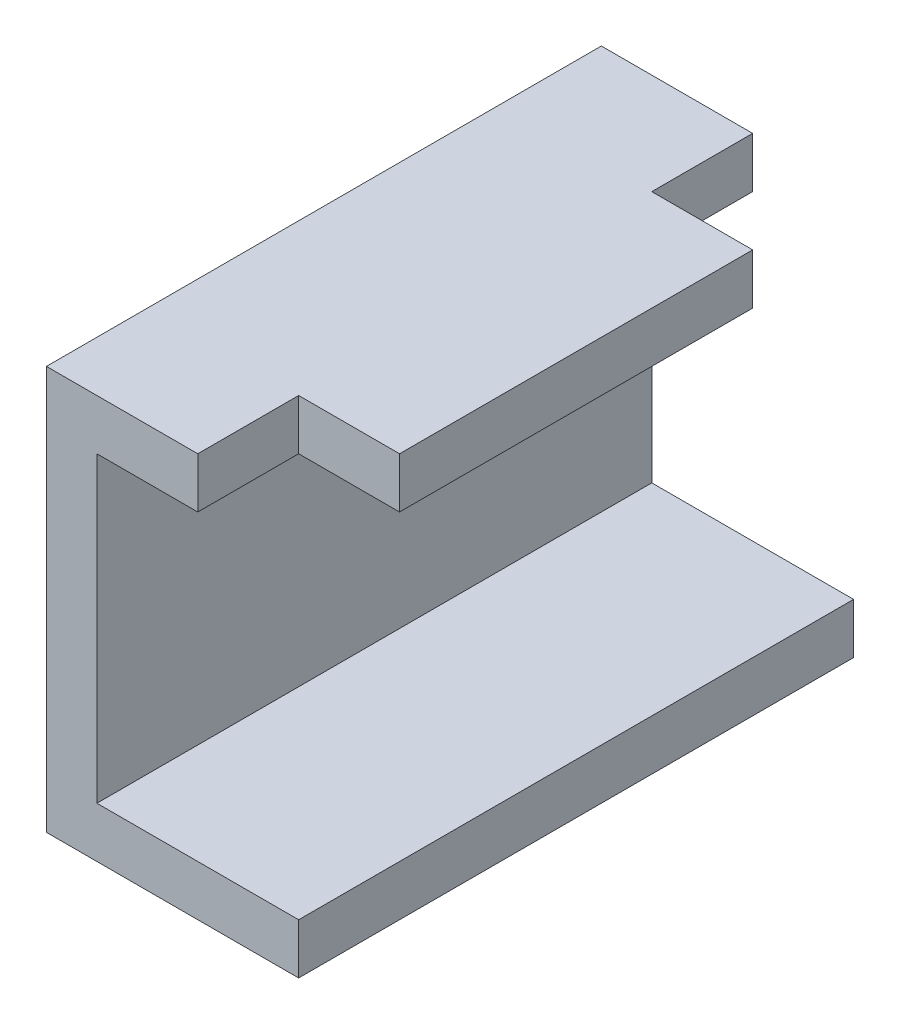
ISO-10303-21;
HEADER;
FILE_DESCRIPTION(('STEP AP214'),'2;1');
FILE_NAME('part.step','',(''),(''),'','','');
FILE_SCHEMA(('AUTOMOTIVE_DESIGN { 1 0 10303 214 1 1 1 1 }'));
ENDSEC;
DATA;
#1=APPLICATION_CONTEXT('core data for automotive mechanical design processes');
#2=APPLICATION_PROTOCOL_DEFINITION('international standard','automotive_design',2000,#1);
#3=PRODUCT_CONTEXT('',#1,'mechanical');
#4=PRODUCT('Part','Part','',(#3));
#5=PRODUCT_RELATED_PRODUCT_CATEGORY('part','',(#4));
#6=PRODUCT_DEFINITION_FORMATION('','',#4);
#7=PRODUCT_DEFINITION_CONTEXT('part definition',#1,'design');
#8=PRODUCT_DEFINITION('design','',#6,#7);
#9=PRODUCT_DEFINITION_SHAPE('','',#8);
#10=(LENGTH_UNIT() NAMED_UNIT(*) SI_UNIT(.MILLI.,.METRE.));
#11=(NAMED_UNIT(*) PLANE_ANGLE_UNIT() SI_UNIT($,.RADIAN.));
#12=(NAMED_UNIT(*) SI_UNIT($,.STERADIAN.) SOLID_ANGLE_UNIT());
#13=UNCERTAINTY_MEASURE_WITH_UNIT(LENGTH_MEASURE(1.E-05),#10,'distance_accuracy_value','');
#14=(GEOMETRIC_REPRESENTATION_CONTEXT(3) GLOBAL_UNCERTAINTY_ASSIGNED_CONTEXT((#13)) GLOBAL_UNIT_ASSIGNED_CONTEXT((#10,
#11,#12)) REPRESENTATION_CONTEXT('',''));
#15=CARTESIAN_POINT('',(0.,0.,0.));
#16=DIRECTION('',(0.,0.,1.));
#17=DIRECTION('',(1.,0.,0.));
#18=AXIS2_PLACEMENT_3D('',#15,#16,#17);
#19=CARTESIAN_POINT('',(4.428,3.0256,3.662));
#20=DIRECTION('',(0.,-1.,0.));
#21=DIRECTION('',(0.,0.,-1.));
#22=AXIS2_PLACEMENT_3D('',#19,#20,#21);
#23=PLANE('',#22);
#24=DIRECTION('',(0.,0.,1.));
#25=VECTOR('',#24,1.);
#26=CARTESIAN_POINT('',(4.628,3.0256,3.662));
#27=LINE('',#26,#25);
#28=CARTESIAN_POINT('',(4.628,3.0256,3.662));
#29=VERTEX_POINT('',#28);
#30=CARTESIAN_POINT('',(4.628,3.0256,4.212));
#31=VERTEX_POINT('',#30);
#32=EDGE_CURVE('E11',#29,#31,#27,.T.);
#33=ORIENTED_EDGE('',*,*,#32,.F.);
#34=DIRECTION('',(1.,0.,0.));
#35=VECTOR('',#34,1.);
#36=CARTESIAN_POINT('',(4.428,3.0256,3.662));
#37=LINE('',#36,#35);
#38=CARTESIAN_POINT('',(4.428,3.0256,3.662));
#39=VERTEX_POINT('',#38);
#40=EDGE_CURVE('E24',#39,#29,#37,.T.);
#41=ORIENTED_EDGE('',*,*,#40,.F.);
#42=DIRECTION('',(0.,0.,-1.));
#43=VECTOR('',#42,1.);
#44=CARTESIAN_POINT('',(4.428,3.0256,3.662));
#45=LINE('',#44,#43);
#46=CARTESIAN_POINT('',(4.428,3.0256,4.212));
#47=VERTEX_POINT('',#46);
#48=EDGE_CURVE('E203',#47,#39,#45,.T.);
#49=ORIENTED_EDGE('',*,*,#48,.F.);
#50=DIRECTION('',(1.,0.,0.));
#51=VECTOR('',#50,1.);
#52=CARTESIAN_POINT('',(4.428,3.0256,4.212));
#53=LINE('',#52,#51);
#54=EDGE_CURVE('E201',#47,#31,#53,.T.);
#55=ORIENTED_EDGE('',*,*,#54,.T.);
#56=EDGE_LOOP('',(#33,#41,#49,#55));
#57=FACE_BOUND('',#56,.T.);
#58=ADVANCED_FACE('F17',(#57),#23,.F.);
#59=CARTESIAN_POINT('',(4.378,2.9756,4.212));
#60=DIRECTION('',(0.,1.,0.));
#61=DIRECTION('',(0.,0.,1.));
#62=AXIS2_PLACEMENT_3D('',#59,#60,#61);
#63=PLANE('',#62);
#64=DIRECTION('',(0.,0.,-1.));
#65=VECTOR('',#64,1.);
#66=CARTESIAN_POINT('',(4.628,2.9756,4.212));
#67=LINE('',#66,#65);
#68=CARTESIAN_POINT('',(4.628,2.9756,4.212));
#69=VERTEX_POINT('',#68);
#70=CARTESIAN_POINT('',(4.628,2.9756,3.662));
#71=VERTEX_POINT('',#70);
#72=EDGE_CURVE('E199',#69,#71,#67,.T.);
#73=ORIENTED_EDGE('',*,*,#72,.F.);
#74=DIRECTION('',(1.,0.,0.));
#75=VECTOR('',#74,1.);
#76=CARTESIAN_POINT('',(4.378,2.9756,4.212));
#77=LINE('',#76,#75);
#78=CARTESIAN_POINT('',(4.378,2.9756,4.212));
#79=VERTEX_POINT('',#78);
#80=EDGE_CURVE('E196',#79,#69,#77,.T.);
#81=ORIENTED_EDGE('',*,*,#80,.F.);
#82=DIRECTION('',(0.,0.,1.));
#83=VECTOR('',#82,1.);
#84=CARTESIAN_POINT('',(4.378,2.9756,4.212));
#85=LINE('',#84,#83);
#86=CARTESIAN_POINT('',(4.378,2.9756,3.662));
#87=VERTEX_POINT('',#86);
#88=EDGE_CURVE('E193',#87,#79,#85,.T.);
#89=ORIENTED_EDGE('',*,*,#88,.F.);
#90=DIRECTION('',(1.,0.,0.));
#91=VECTOR('',#90,1.);
#92=CARTESIAN_POINT('',(4.378,2.9756,3.662));
#93=LINE('',#92,#91);
#94=EDGE_CURVE('E190',#87,#71,#93,.T.);
#95=ORIENTED_EDGE('',*,*,#94,.T.);
#96=EDGE_LOOP('',(#73,#81,#89,#95));
#97=FACE_BOUND('',#96,.T.);
#98=ADVANCED_FACE('F213',(#97),#63,.F.);
#99=CARTESIAN_POINT('',(4.428,3.3256,3.662));
#100=DIRECTION('',(1.,0.,0.));
#101=DIRECTION('',(0.,1.,0.));
#102=AXIS2_PLACEMENT_3D('',#99,#100,#101);
#103=PLANE('',#102);
#104=DIRECTION('',(0.,-1.,0.));
#105=VECTOR('',#104,1.);
#106=CARTESIAN_POINT('',(4.428,3.3256,4.212));
#107=LINE('',#106,#105);
#108=CARTESIAN_POINT('',(4.428,3.3256,4.212));
#109=VERTEX_POINT('',#108);
#110=EDGE_CURVE('E187',#109,#47,#107,.T.);
#111=ORIENTED_EDGE('',*,*,#110,.T.);
#112=ORIENTED_EDGE('',*,*,#48,.T.);
#113=DIRECTION('',(0.,-1.,0.));
#114=VECTOR('',#113,1.);
#115=CARTESIAN_POINT('',(4.428,3.3256,3.662));
#116=LINE('',#115,#114);
#117=CARTESIAN_POINT('',(4.428,3.3256,3.662));
#118=VERTEX_POINT('',#117);
#119=EDGE_CURVE('E184',#118,#39,#116,.T.);
#120=ORIENTED_EDGE('',*,*,#119,.F.);
#121=DIRECTION('',(0.,0.,1.));
#122=VECTOR('',#121,1.);
#123=CARTESIAN_POINT('',(4.428,3.3256,3.662));
#124=LINE('',#123,#122);
#125=EDGE_CURVE('E181',#118,#109,#124,.T.);
#126=ORIENTED_EDGE('',*,*,#125,.T.);
#127=EDGE_LOOP('',(#111,#112,#120,#126));
#128=FACE_BOUND('',#127,.T.);
#129=ADVANCED_FACE('F223',(#128),#103,.T.);
#130=CARTESIAN_POINT('',(4.378,3.3756,4.212));
#131=DIRECTION('',(-1.,0.,0.));
#132=DIRECTION('',(0.,-1.,0.));
#133=AXIS2_PLACEMENT_3D('',#130,#131,#132);
#134=PLANE('',#133);
#135=DIRECTION('',(0.,-1.,0.));
#136=VECTOR('',#135,1.);
#137=CARTESIAN_POINT('',(4.378,3.3756,3.662));
#138=LINE('',#137,#136);
#139=CARTESIAN_POINT('',(4.378,3.3756,3.662));
#140=VERTEX_POINT('',#139);
#141=EDGE_CURVE('E178',#140,#87,#138,.T.);
#142=ORIENTED_EDGE('',*,*,#141,.T.);
#143=ORIENTED_EDGE('',*,*,#88,.T.);
#144=DIRECTION('',(0.,-1.,0.));
#145=VECTOR('',#144,1.);
#146=CARTESIAN_POINT('',(4.378,3.3756,4.212));
#147=LINE('',#146,#145);
#148=CARTESIAN_POINT('',(4.378,3.3756,4.212));
#149=VERTEX_POINT('',#148);
#150=EDGE_CURVE('E175',#149,#79,#147,.T.);
#151=ORIENTED_EDGE('',*,*,#150,.F.);
#152=DIRECTION('',(0.,0.,-1.));
#153=VECTOR('',#152,1.);
#154=CARTESIAN_POINT('',(4.378,3.3756,4.212));
#155=LINE('',#154,#153);
#156=EDGE_CURVE('E172',#149,#140,#155,.T.);
#157=ORIENTED_EDGE('',*,*,#156,.T.);
#158=EDGE_LOOP('',(#142,#143,#151,#157));
#159=FACE_BOUND('',#158,.T.);
#160=ADVANCED_FACE('F215',(#159),#134,.T.);
#161=CARTESIAN_POINT('',(3.8507319491406,3.3256,3.662));
#162=DIRECTION('',(0.,1.,0.));
#163=DIRECTION('',(-1.,0.,0.));
#164=AXIS2_PLACEMENT_3D('',#161,#162,#163);
#165=PLANE('',#164);
#166=DIRECTION('',(0.,0.,1.));
#167=VECTOR('',#166,1.);
#168=CARTESIAN_POINT('',(4.628,3.3256,3.662));
#169=LINE('',#168,#167);
#170=CARTESIAN_POINT('',(4.628,3.3256,3.762));
#171=VERTEX_POINT('',#170);
#172=CARTESIAN_POINT('',(4.628,3.3256,4.112));
#173=VERTEX_POINT('',#172);
#174=EDGE_CURVE('E170',#171,#173,#169,.T.);
#175=ORIENTED_EDGE('',*,*,#174,.T.);
#176=DIRECTION('',(1.,0.,0.));
#177=VECTOR('',#176,1.);
#178=CARTESIAN_POINT('',(4.628,3.3256,4.112));
#179=LINE('',#178,#177);
#180=CARTESIAN_POINT('',(4.528,3.3256,4.112));
#181=VERTEX_POINT('',#180);
#182=EDGE_CURVE('E167',#181,#173,#179,.T.);
#183=ORIENTED_EDGE('',*,*,#182,.F.);
#184=DIRECTION('',(0.,0.,-1.));
#185=VECTOR('',#184,1.);
#186=CARTESIAN_POINT('',(4.528,3.3256,4.212));
#187=LINE('',#186,#185);
#188=CARTESIAN_POINT('',(4.528,3.3256,4.212));
#189=VERTEX_POINT('',#188);
#190=EDGE_CURVE('E164',#189,#181,#187,.T.);
#191=ORIENTED_EDGE('',*,*,#190,.F.);
#192=DIRECTION('',(1.,0.,0.));
#193=VECTOR('',#192,1.);
#194=CARTESIAN_POINT('',(3.8507319491406,3.3256,4.212));
#195=LINE('',#194,#193);
#196=EDGE_CURVE('E161',#109,#189,#195,.T.);
#197=ORIENTED_EDGE('',*,*,#196,.F.);
#198=ORIENTED_EDGE('',*,*,#125,.F.);
#199=DIRECTION('',(1.,0.,0.));
#200=VECTOR('',#199,1.);
#201=CARTESIAN_POINT('',(3.8507319491406,3.3256,3.662));
#202=LINE('',#201,#200);
#203=CARTESIAN_POINT('',(4.528,3.3256,3.662));
#204=VERTEX_POINT('',#203);
#205=EDGE_CURVE('E159',#118,#204,#202,.T.);
#206=ORIENTED_EDGE('',*,*,#205,.T.);
#207=DIRECTION('',(0.,0.,-1.));
#208=VECTOR('',#207,1.);
#209=CARTESIAN_POINT('',(4.528,3.3256,3.662));
#210=LINE('',#209,#208);
#211=CARTESIAN_POINT('',(4.528,3.3256,3.762));
#212=VERTEX_POINT('',#211);
#213=EDGE_CURVE('E157',#212,#204,#210,.T.);
#214=ORIENTED_EDGE('',*,*,#213,.F.);
#215=DIRECTION('',(-1.,0.,0.));
#216=VECTOR('',#215,1.);
#217=CARTESIAN_POINT('',(4.628,3.3256,3.762));
#218=LINE('',#217,#216);
#219=EDGE_CURVE('E127',#171,#212,#218,.T.);
#220=ORIENTED_EDGE('',*,*,#219,.F.);
#221=EDGE_LOOP('',(#175,#183,#191,#197,#198,#206,#214,#220));
#222=FACE_BOUND('',#221,.T.);
#223=ADVANCED_FACE('F220',(#222),#165,.F.);
#224=CARTESIAN_POINT('',(3.8507319491406,3.3756,3.662));
#225=DIRECTION('',(0.,0.,1.));
#226=DIRECTION('',(0.,-1.,0.));
#227=AXIS2_PLACEMENT_3D('',#224,#225,#226);
#228=PLANE('',#227);
#229=DIRECTION('',(1.,0.,0.));
#230=VECTOR('',#229,1.);
#231=CARTESIAN_POINT('',(3.8507319491406,3.3756,3.662));
#232=LINE('',#231,#230);
#233=CARTESIAN_POINT('',(4.528,3.3756,3.662));
#234=VERTEX_POINT('',#233);
#235=EDGE_CURVE('E154',#140,#234,#232,.T.);
#236=ORIENTED_EDGE('',*,*,#235,.T.);
#237=DIRECTION('',(0.,1.,0.));
#238=VECTOR('',#237,1.);
#239=CARTESIAN_POINT('',(4.528,2.9746,3.662));
#240=LINE('',#239,#238);
#241=EDGE_CURVE('E121',#204,#234,#240,.T.);
#242=ORIENTED_EDGE('',*,*,#241,.F.);
#243=ORIENTED_EDGE('',*,*,#205,.F.);
#244=ORIENTED_EDGE('',*,*,#119,.T.);
#245=ORIENTED_EDGE('',*,*,#40,.T.);
#246=DIRECTION('',(0.,1.,0.));
#247=VECTOR('',#246,1.);
#248=CARTESIAN_POINT('',(4.628,3.1756,3.662));
#249=LINE('',#248,#247);
#250=EDGE_CURVE('E151',#71,#29,#249,.T.);
#251=ORIENTED_EDGE('',*,*,#250,.F.);
#252=ORIENTED_EDGE('',*,*,#94,.F.);
#253=ORIENTED_EDGE('',*,*,#141,.F.);
#254=EDGE_LOOP('',(#236,#242,#243,#244,#245,#251,#252,#253));
#255=FACE_BOUND('',#254,.T.);
#256=ADVANCED_FACE('F207',(#255),#228,.F.);
#257=CARTESIAN_POINT('',(3.8507319491406,3.3756,4.212));
#258=DIRECTION('',(0.,-1.,0.));
#259=DIRECTION('',(1.,0.,0.));
#260=AXIS2_PLACEMENT_3D('',#257,#258,#259);
#261=PLANE('',#260);
#262=DIRECTION('',(0.,0.,1.));
#263=VECTOR('',#262,1.);
#264=CARTESIAN_POINT('',(4.528,3.3756,4.212));
#265=LINE('',#264,#263);
#266=CARTESIAN_POINT('',(4.528,3.3756,4.112));
#267=VERTEX_POINT('',#266);
#268=CARTESIAN_POINT('',(4.528,3.3756,4.212));
#269=VERTEX_POINT('',#268);
#270=EDGE_CURVE('E149',#267,#269,#265,.T.);
#271=ORIENTED_EDGE('',*,*,#270,.F.);
#272=DIRECTION('',(-1.,0.,0.));
#273=VECTOR('',#272,1.);
#274=CARTESIAN_POINT('',(4.628,3.3756,4.112));
#275=LINE('',#274,#273);
#276=CARTESIAN_POINT('',(4.628,3.3756,4.112));
#277=VERTEX_POINT('',#276);
#278=EDGE_CURVE('E146',#277,#267,#275,.T.);
#279=ORIENTED_EDGE('',*,*,#278,.F.);
#280=DIRECTION('',(0.,0.,-1.));
#281=VECTOR('',#280,1.);
#282=CARTESIAN_POINT('',(4.628,3.3756,4.212));
#283=LINE('',#282,#281);
#284=CARTESIAN_POINT('',(4.628,3.3756,3.762));
#285=VERTEX_POINT('',#284);
#286=EDGE_CURVE('E108',#277,#285,#283,.T.);
#287=ORIENTED_EDGE('',*,*,#286,.T.);
#288=DIRECTION('',(1.,0.,0.));
#289=VECTOR('',#288,1.);
#290=CARTESIAN_POINT('',(4.628,3.3756,3.762));
#291=LINE('',#290,#289);
#292=CARTESIAN_POINT('',(4.528,3.3756,3.762));
#293=VERTEX_POINT('',#292);
#294=EDGE_CURVE('E102',#293,#285,#291,.T.);
#295=ORIENTED_EDGE('',*,*,#294,.F.);
#296=DIRECTION('',(0.,0.,1.));
#297=VECTOR('',#296,1.);
#298=CARTESIAN_POINT('',(4.528,3.3756,3.662));
#299=LINE('',#298,#297);
#300=EDGE_CURVE('E106',#234,#293,#299,.T.);
#301=ORIENTED_EDGE('',*,*,#300,.F.);
#302=ORIENTED_EDGE('',*,*,#235,.F.);
#303=ORIENTED_EDGE('',*,*,#156,.F.);
#304=DIRECTION('',(1.,0.,0.));
#305=VECTOR('',#304,1.);
#306=CARTESIAN_POINT('',(3.8507319491406,3.3756,4.212));
#307=LINE('',#306,#305);
#308=EDGE_CURVE('E122',#149,#269,#307,.T.);
#309=ORIENTED_EDGE('',*,*,#308,.T.);
#310=EDGE_LOOP('',(#271,#279,#287,#295,#301,#302,#303,#309));
#311=FACE_BOUND('',#310,.T.);
#312=ADVANCED_FACE('F104',(#311),#261,.F.);
#313=CARTESIAN_POINT('',(3.8507319491406,3.3256,4.212));
#314=DIRECTION('',(0.,0.,-1.));
#315=DIRECTION('',(-1.,0.,0.));
#316=AXIS2_PLACEMENT_3D('',#313,#314,#315);
#317=PLANE('',#316);
#318=ORIENTED_EDGE('',*,*,#196,.T.);
#319=DIRECTION('',(0.,1.,0.));
#320=VECTOR('',#319,1.);
#321=CARTESIAN_POINT('',(4.528,2.9746,4.212));
#322=LINE('',#321,#320);
#323=EDGE_CURVE('E140',#189,#269,#322,.T.);
#324=ORIENTED_EDGE('',*,*,#323,.T.);
#325=ORIENTED_EDGE('',*,*,#308,.F.);
#326=ORIENTED_EDGE('',*,*,#150,.T.);
#327=ORIENTED_EDGE('',*,*,#80,.T.);
#328=DIRECTION('',(0.,-1.,0.));
#329=VECTOR('',#328,1.);
#330=CARTESIAN_POINT('',(4.628,3.1756,4.212));
#331=LINE('',#330,#329);
#332=EDGE_CURVE('E138',#31,#69,#331,.T.);
#333=ORIENTED_EDGE('',*,*,#332,.F.);
#334=ORIENTED_EDGE('',*,*,#54,.F.);
#335=ORIENTED_EDGE('',*,*,#110,.F.);
#336=EDGE_LOOP('',(#318,#324,#325,#326,#327,#333,#334,#335));
#337=FACE_BOUND('',#336,.T.);
#338=ADVANCED_FACE('F226',(#337),#317,.F.);
#339=CARTESIAN_POINT('',(4.628,3.3756,4.212));
#340=DIRECTION('',(-1.,0.,0.));
#341=DIRECTION('',(0.,0.,1.));
#342=AXIS2_PLACEMENT_3D('',#339,#340,#341);
#343=PLANE('',#342);
#344=ORIENTED_EDGE('',*,*,#286,.F.);
#345=DIRECTION('',(0.,1.,0.));
#346=VECTOR('',#345,1.);
#347=CARTESIAN_POINT('',(4.628,2.9746,4.112));
#348=LINE('',#347,#346);
#349=EDGE_CURVE('E131',#173,#277,#348,.T.);
#350=ORIENTED_EDGE('',*,*,#349,.F.);
#351=ORIENTED_EDGE('',*,*,#174,.F.);
#352=DIRECTION('',(0.,1.,0.));
#353=VECTOR('',#352,1.);
#354=CARTESIAN_POINT('',(4.628,2.9746,3.762));
#355=LINE('',#354,#353);
#356=EDGE_CURVE('E128',#171,#285,#355,.T.);
#357=ORIENTED_EDGE('',*,*,#356,.T.);
#358=EDGE_LOOP('',(#344,#350,#351,#357));
#359=FACE_BOUND('',#358,.T.);
#360=ADVANCED_FACE('F235',(#359),#343,.F.);
#361=CARTESIAN_POINT('',(4.628,3.0006,3.937));
#362=DIRECTION('',(1.,0.,0.));
#363=DIRECTION('',(0.,0.,-1.));
#364=AXIS2_PLACEMENT_3D('',#361,#362,#363);
#365=PLANE('',#364);
#366=ORIENTED_EDGE('',*,*,#332,.T.);
#367=ORIENTED_EDGE('',*,*,#72,.T.);
#368=ORIENTED_EDGE('',*,*,#250,.T.);
#369=ORIENTED_EDGE('',*,*,#32,.T.);
#370=EDGE_LOOP('',(#366,#367,#368,#369));
#371=FACE_BOUND('',#370,.T.);
#372=ADVANCED_FACE('F210',(#371),#365,.T.);
#373=CARTESIAN_POINT('',(4.528,2.9746,3.662));
#374=DIRECTION('',(-1.,0.,0.));
#375=DIRECTION('',(0.,-1.,0.));
#376=AXIS2_PLACEMENT_3D('',#373,#374,#375);
#377=PLANE('',#376);
#378=ORIENTED_EDGE('',*,*,#213,.T.);
#379=ORIENTED_EDGE('',*,*,#241,.T.);
#380=ORIENTED_EDGE('',*,*,#300,.T.);
#381=DIRECTION('',(0.,1.,0.));
#382=VECTOR('',#381,1.);
#383=CARTESIAN_POINT('',(4.528,2.9746,3.762));
#384=LINE('',#383,#382);
#385=EDGE_CURVE('E119',#212,#293,#384,.T.);
#386=ORIENTED_EDGE('',*,*,#385,.F.);
#387=EDGE_LOOP('',(#378,#379,#380,#386));
#388=FACE_BOUND('',#387,.T.);
#389=ADVANCED_FACE('F118',(#388),#377,.F.);
#390=CARTESIAN_POINT('',(4.628,2.9746,3.762));
#391=DIRECTION('',(0.,0.,1.));
#392=DIRECTION('',(0.,-1.,0.));
#393=AXIS2_PLACEMENT_3D('',#390,#391,#392);
#394=PLANE('',#393);
#395=ORIENTED_EDGE('',*,*,#219,.T.);
#396=ORIENTED_EDGE('',*,*,#385,.T.);
#397=ORIENTED_EDGE('',*,*,#294,.T.);
#398=ORIENTED_EDGE('',*,*,#356,.F.);
#399=EDGE_LOOP('',(#395,#396,#397,#398));
#400=FACE_BOUND('',#399,.T.);
#401=ADVANCED_FACE('F125',(#400),#394,.F.);
#402=CARTESIAN_POINT('',(4.628,2.9746,4.112));
#403=DIRECTION('',(0.,0.,-1.));
#404=DIRECTION('',(0.,1.,0.));
#405=AXIS2_PLACEMENT_3D('',#402,#403,#404);
#406=PLANE('',#405);
#407=ORIENTED_EDGE('',*,*,#182,.T.);
#408=ORIENTED_EDGE('',*,*,#349,.T.);
#409=ORIENTED_EDGE('',*,*,#278,.T.);
#410=DIRECTION('',(0.,1.,0.));
#411=VECTOR('',#410,1.);
#412=CARTESIAN_POINT('',(4.528,2.9746,4.112));
#413=LINE('',#412,#411);
#414=EDGE_CURVE('E129',#181,#267,#413,.T.);
#415=ORIENTED_EDGE('',*,*,#414,.F.);
#416=EDGE_LOOP('',(#407,#408,#409,#415));
#417=FACE_BOUND('',#416,.T.);
#418=ADVANCED_FACE('F231',(#417),#406,.F.);
#419=CARTESIAN_POINT('',(4.528,2.9746,4.212));
#420=DIRECTION('',(-1.,0.,0.));
#421=DIRECTION('',(0.,-1.,0.));
#422=AXIS2_PLACEMENT_3D('',#419,#420,#421);
#423=PLANE('',#422);
#424=ORIENTED_EDGE('',*,*,#190,.T.);
#425=ORIENTED_EDGE('',*,*,#414,.T.);
#426=ORIENTED_EDGE('',*,*,#270,.T.);
#427=ORIENTED_EDGE('',*,*,#323,.F.);
#428=EDGE_LOOP('',(#424,#425,#426,#427));
#429=FACE_BOUND('',#428,.T.);
#430=ADVANCED_FACE('F233',(#429),#423,.F.);
#431=CLOSED_SHELL('',(#58,#98,#129,#160,#223,#256,#312,#338,#360,#372,#389,#401,#418,#430));
#432=MANIFOLD_SOLID_BREP('B1',#431);
#433=ADVANCED_BREP_SHAPE_REPRESENTATION('',(#18,#432),#14);
#434=SHAPE_DEFINITION_REPRESENTATION(#9,#433);
ENDSEC;
END-ISO-10303-21;
